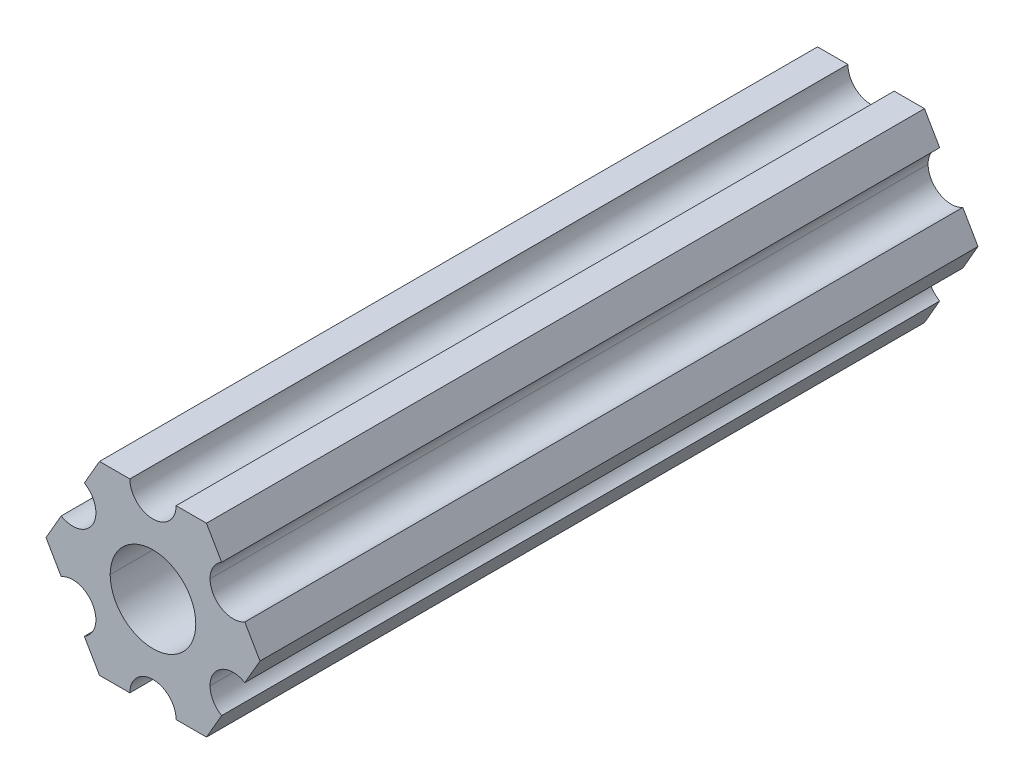
ISO-10303-21;
HEADER;
FILE_DESCRIPTION(('STEP AP214'),'2;1');
FILE_NAME('part.step','',(''),(''),'','','');
FILE_SCHEMA(('AUTOMOTIVE_DESIGN { 1 0 10303 214 1 1 1 1 }'));
ENDSEC;
DATA;
#1=APPLICATION_CONTEXT('core data for automotive mechanical design processes');
#2=APPLICATION_PROTOCOL_DEFINITION('international standard','automotive_design',2000,#1);
#3=PRODUCT_CONTEXT('',#1,'mechanical');
#4=PRODUCT('Part','Part','',(#3));
#5=PRODUCT_RELATED_PRODUCT_CATEGORY('part','',(#4));
#6=PRODUCT_DEFINITION_FORMATION('','',#4);
#7=PRODUCT_DEFINITION_CONTEXT('part definition',#1,'design');
#8=PRODUCT_DEFINITION('design','',#6,#7);
#9=PRODUCT_DEFINITION_SHAPE('','',#8);
#10=(LENGTH_UNIT() NAMED_UNIT(*) SI_UNIT(.MILLI.,.METRE.));
#11=(NAMED_UNIT(*) PLANE_ANGLE_UNIT() SI_UNIT($,.RADIAN.));
#12=(NAMED_UNIT(*) SI_UNIT($,.STERADIAN.) SOLID_ANGLE_UNIT());
#13=UNCERTAINTY_MEASURE_WITH_UNIT(LENGTH_MEASURE(1.E-05),#10,'distance_accuracy_value','');
#14=(GEOMETRIC_REPRESENTATION_CONTEXT(3) GLOBAL_UNCERTAINTY_ASSIGNED_CONTEXT((#13)) GLOBAL_UNIT_ASSIGNED_CONTEXT((#10,
#11,#12)) REPRESENTATION_CONTEXT('',''));
#15=CARTESIAN_POINT('',(0.,0.,0.));
#16=DIRECTION('',(0.,0.,1.));
#17=DIRECTION('',(1.,0.,0.));
#18=AXIS2_PLACEMENT_3D('',#15,#16,#17);
#19=CARTESIAN_POINT('',(0.,0.,304.8));
#20=DIRECTION('',(0.,0.,-1.));
#21=DIRECTION('',(-1.,0.,0.));
#22=AXIS2_PLACEMENT_3D('',#19,#20,#21);
#23=CYLINDRICAL_SURFACE('',#22,2.9337);
#24=CARTESIAN_POINT('',(0.,0.,49.2125));
#25=DIRECTION('',(0.,0.,1.));
#26=DIRECTION('',(1.,0.,0.));
#27=AXIS2_PLACEMENT_3D('',#24,#25,#26);
#28=CIRCLE('',#27,2.9337);
#29=CARTESIAN_POINT('',(2.9337,0.,49.2125));
#30=VERTEX_POINT('',#29);
#31=CARTESIAN_POINT('',(-2.9337,0.,49.2125));
#32=VERTEX_POINT('',#31);
#33=EDGE_CURVE('E66',#30,#32,#28,.F.);
#34=ORIENTED_EDGE('',*,*,#33,.F.);
#35=DIRECTION('',(0.,0.,-1.));
#36=VECTOR('',#35,1.);
#37=CARTESIAN_POINT('',(2.9337,0.,304.8));
#38=LINE('',#37,#36);
#39=CARTESIAN_POINT('',(2.9337,0.,0.));
#40=VERTEX_POINT('',#39);
#41=EDGE_CURVE('E53',#30,#40,#38,.T.);
#42=ORIENTED_EDGE('',*,*,#41,.T.);
#43=CARTESIAN_POINT('',(0.,0.,0.));
#44=DIRECTION('',(0.,0.,1.));
#45=DIRECTION('',(1.,0.,0.));
#46=AXIS2_PLACEMENT_3D('',#43,#44,#45);
#47=CIRCLE('',#46,2.9337);
#48=CARTESIAN_POINT('',(-2.9337,0.,0.));
#49=VERTEX_POINT('',#48);
#50=EDGE_CURVE('E249',#49,#40,#47,.T.);
#51=ORIENTED_EDGE('',*,*,#50,.F.);
#52=DIRECTION('',(0.,0.,-1.));
#53=VECTOR('',#52,1.);
#54=CARTESIAN_POINT('',(-2.9337,0.,304.8));
#55=LINE('',#54,#53);
#56=EDGE_CURVE('E219',#32,#49,#55,.T.);
#57=ORIENTED_EDGE('',*,*,#56,.F.);
#58=EDGE_LOOP('',(#34,#42,#51,#57));
#59=FACE_BOUND('',#58,.T.);
#60=ADVANCED_FACE('F46',(#59),#23,.F.);
#61=CARTESIAN_POINT('',(5.49926150638082,-3.17499966684067,304.8));
#62=DIRECTION('',(0.,0.,-1.));
#63=DIRECTION('',(-1.,0.,0.));
#64=AXIS2_PLACEMENT_3D('',#61,#62,#63);
#65=CYLINDRICAL_SURFACE('',#64,1.5875);
#66=CARTESIAN_POINT('',(5.49926150638082,-3.17499966684067,49.2125));
#67=DIRECTION('',(0.,0.,1.));
#68=DIRECTION('',(1.,0.,0.));
#69=AXIS2_PLACEMENT_3D('',#66,#67,#68);
#70=CIRCLE('',#69,1.5875);
#71=CARTESIAN_POINT('',(3.91176150638082,-3.17499966684067,49.2125));
#72=VERTEX_POINT('',#71);
#73=CARTESIAN_POINT('',(6.29301142309098,-1.80018429024546,49.2125));
#74=VERTEX_POINT('',#73);
#75=EDGE_CURVE('E373',#72,#74,#70,.F.);
#76=ORIENTED_EDGE('',*,*,#75,.F.);
#77=DIRECTION('',(0.,0.,-1.));
#78=VECTOR('',#77,1.);
#79=CARTESIAN_POINT('',(3.91176150638082,-3.17499966684067,304.8));
#80=LINE('',#79,#78);
#81=CARTESIAN_POINT('',(3.91176150638082,-3.17499966684067,0.));
#82=VERTEX_POINT('',#81);
#83=EDGE_CURVE('E226',#72,#82,#80,.T.);
#84=ORIENTED_EDGE('',*,*,#83,.T.);
#85=CARTESIAN_POINT('',(5.49926150638082,-3.17499966684067,0.));
#86=DIRECTION('',(0.,0.,-1.));
#87=DIRECTION('',(1.,0.,0.));
#88=AXIS2_PLACEMENT_3D('',#85,#86,#87);
#89=CIRCLE('',#88,1.5875);
#90=CARTESIAN_POINT('',(6.29301142309098,-1.80018429024546,0.));
#91=VERTEX_POINT('',#90);
#92=EDGE_CURVE('E228',#82,#91,#89,.T.);
#93=ORIENTED_EDGE('',*,*,#92,.T.);
#94=DIRECTION('',(0.,0.,-1.));
#95=VECTOR('',#94,1.);
#96=CARTESIAN_POINT('',(6.29301142309098,-1.80018429024546,304.8));
#97=LINE('',#96,#95);
#98=EDGE_CURVE('E354',#74,#91,#97,.T.);
#99=ORIENTED_EDGE('',*,*,#98,.F.);
#100=EDGE_LOOP('',(#76,#84,#93,#99));
#101=FACE_BOUND('',#100,.T.);
#102=ADVANCED_FACE('F409',(#101),#65,.F.);
#103=CARTESIAN_POINT('',(5.49926112168156,3.17500033315934,304.8));
#104=DIRECTION('',(0.,0.,-1.));
#105=DIRECTION('',(-1.,0.,0.));
#106=AXIS2_PLACEMENT_3D('',#103,#104,#105);
#107=CYLINDRICAL_SURFACE('',#106,1.5875);
#108=CARTESIAN_POINT('',(5.49926112168156,3.17500033315934,49.2125));
#109=DIRECTION('',(0.,0.,1.));
#110=DIRECTION('',(1.,0.,0.));
#111=AXIS2_PLACEMENT_3D('',#108,#109,#110);
#112=CIRCLE('',#111,1.5875);
#113=CARTESIAN_POINT('',(3.91176112168156,3.17500033315934,49.2125));
#114=VERTEX_POINT('',#113);
#115=CARTESIAN_POINT('',(4.70551103839172,4.54981561357972,49.2125));
#116=VERTEX_POINT('',#115);
#117=EDGE_CURVE('E375',#114,#116,#112,.F.);
#118=ORIENTED_EDGE('',*,*,#117,.F.);
#119=DIRECTION('',(0.,0.,-1.));
#120=VECTOR('',#119,1.);
#121=CARTESIAN_POINT('',(3.91176112168156,3.17500033315934,304.8));
#122=LINE('',#121,#120);
#123=CARTESIAN_POINT('',(3.91176112168156,3.17500033315934,0.));
#124=VERTEX_POINT('',#123);
#125=EDGE_CURVE('E248',#114,#124,#122,.T.);
#126=ORIENTED_EDGE('',*,*,#125,.T.);
#127=CARTESIAN_POINT('',(5.49926112168156,3.17500033315934,0.));
#128=DIRECTION('',(0.,0.,-1.));
#129=DIRECTION('',(1.,0.,0.));
#130=AXIS2_PLACEMENT_3D('',#127,#128,#129);
#131=CIRCLE('',#130,1.5875);
#132=CARTESIAN_POINT('',(4.70551103839172,4.54981561357972,0.));
#133=VERTEX_POINT('',#132);
#134=EDGE_CURVE('E244',#124,#133,#131,.T.);
#135=ORIENTED_EDGE('',*,*,#134,.T.);
#136=DIRECTION('',(0.,0.,-1.));
#137=VECTOR('',#136,1.);
#138=CARTESIAN_POINT('',(4.70551103839172,4.54981561357972,304.8));
#139=LINE('',#138,#137);
#140=EDGE_CURVE('E287',#116,#133,#139,.T.);
#141=ORIENTED_EDGE('',*,*,#140,.F.);
#142=EDGE_LOOP('',(#118,#126,#135,#141));
#143=FACE_BOUND('',#142,.T.);
#144=ADVANCED_FACE('F483',(#143),#107,.F.);
#145=CARTESIAN_POINT('',(6.29301142309098,-1.80018429024546,304.8));
#146=DIRECTION('',(-0.866025434075723,0.499999947533953,0.));
#147=DIRECTION('',(0.,0.,1.));
#148=AXIS2_PLACEMENT_3D('',#145,#146,#147);
#149=PLANE('',#148);
#150=DIRECTION('',(0.499999947533953,0.866025434075723,0.));
#151=VECTOR('',#150,1.);
#152=CARTESIAN_POINT('',(6.29301142309098,-1.80018429024546,49.2125));
#153=LINE('',#152,#151);
#154=CARTESIAN_POINT('',(7.33234841870827,4.44212519169686E-07,49.2125));
#155=VERTEX_POINT('',#154);
#156=EDGE_CURVE('E293',#74,#155,#153,.T.);
#157=ORIENTED_EDGE('',*,*,#156,.F.);
#158=ORIENTED_EDGE('',*,*,#98,.T.);
#159=DIRECTION('',(0.499999947533953,0.866025434075723,0.));
#160=VECTOR('',#159,1.);
#161=CARTESIAN_POINT('',(6.29301142309098,-1.80018429024546,0.));
#162=LINE('',#161,#160);
#163=CARTESIAN_POINT('',(7.33234841870827,4.44212519169686E-07,0.));
#164=VERTEX_POINT('',#163);
#165=EDGE_CURVE('E252',#91,#164,#162,.T.);
#166=ORIENTED_EDGE('',*,*,#165,.T.);
#167=DIRECTION('',(0.,0.,-1.));
#168=VECTOR('',#167,1.);
#169=CARTESIAN_POINT('',(7.33234841870827,4.44212519169686E-07,304.8));
#170=LINE('',#169,#168);
#171=EDGE_CURVE('E259',#155,#164,#170,.T.);
#172=ORIENTED_EDGE('',*,*,#171,.F.);
#173=EDGE_LOOP('',(#157,#158,#166,#172));
#174=FACE_BOUND('',#173,.T.);
#175=ADVANCED_FACE('F492',(#174),#149,.F.);
#176=CARTESIAN_POINT('',(7.33234841870827,4.44212519169686E-07,304.8));
#177=DIRECTION('',(-0.866025373493145,-0.500000052466057,0.));
#178=DIRECTION('',(-0.500000052466057,0.866025373493145,0.));
#179=AXIS2_PLACEMENT_3D('',#176,#177,#178);
#180=PLANE('',#179);
#181=DIRECTION('',(-0.500000052466057,0.866025373493145,0.));
#182=VECTOR('',#181,1.);
#183=CARTESIAN_POINT('',(7.33234841870827,4.44212519169686E-07,49.2125));
#184=LINE('',#183,#182);
#185=CARTESIAN_POINT('',(6.29301120497139,1.80018505273895,49.2125));
#186=VERTEX_POINT('',#185);
#187=EDGE_CURVE('E369',#155,#186,#184,.T.);
#188=ORIENTED_EDGE('',*,*,#187,.F.);
#189=ORIENTED_EDGE('',*,*,#171,.T.);
#190=DIRECTION('',(-0.500000052466056,0.866025373493145,0.));
#191=VECTOR('',#190,1.);
#192=CARTESIAN_POINT('',(7.33234841870827,4.44212519169686E-07,0.));
#193=LINE('',#192,#191);
#194=CARTESIAN_POINT('',(6.29301120497139,1.80018505273894,0.));
#195=VERTEX_POINT('',#194);
#196=EDGE_CURVE('E342',#164,#195,#193,.T.);
#197=ORIENTED_EDGE('',*,*,#196,.T.);
#198=DIRECTION('',(0.,0.,-1.));
#199=VECTOR('',#198,1.);
#200=CARTESIAN_POINT('',(6.29301120497139,1.80018505273894,304.8));
#201=LINE('',#200,#199);
#202=EDGE_CURVE('E257',#186,#195,#201,.T.);
#203=ORIENTED_EDGE('',*,*,#202,.F.);
#204=EDGE_LOOP('',(#188,#189,#197,#203));
#205=FACE_BOUND('',#204,.T.);
#206=ADVANCED_FACE('F490',(#205),#180,.F.);
#207=CARTESIAN_POINT('',(5.49926112168156,3.17500033315934,304.8));
#208=DIRECTION('',(0.,0.,-1.));
#209=DIRECTION('',(-1.,0.,0.));
#210=AXIS2_PLACEMENT_3D('',#207,#208,#209);
#211=CYLINDRICAL_SURFACE('',#210,1.5875);
#212=CARTESIAN_POINT('',(5.49926112168156,3.17500033315934,49.2125));
#213=DIRECTION('',(0.,0.,1.));
#214=DIRECTION('',(1.,0.,0.));
#215=AXIS2_PLACEMENT_3D('',#212,#213,#214);
#216=CIRCLE('',#215,1.5875);
#217=EDGE_CURVE('E371',#186,#114,#216,.F.);
#218=ORIENTED_EDGE('',*,*,#217,.F.);
#219=ORIENTED_EDGE('',*,*,#202,.T.);
#220=CARTESIAN_POINT('',(5.49926112168156,3.17500033315934,0.));
#221=DIRECTION('',(0.,0.,-1.));
#222=DIRECTION('',(1.,0.,0.));
#223=AXIS2_PLACEMENT_3D('',#220,#221,#222);
#224=CIRCLE('',#223,1.5875);
#225=EDGE_CURVE('E260',#195,#124,#224,.T.);
#226=ORIENTED_EDGE('',*,*,#225,.T.);
#227=ORIENTED_EDGE('',*,*,#125,.F.);
#228=EDGE_LOOP('',(#218,#219,#226,#227));
#229=FACE_BOUND('',#228,.T.);
#230=ADVANCED_FACE('F488',(#229),#211,.F.);
#231=CARTESIAN_POINT('',(4.70551103839172,4.54981561357972,304.8));
#232=DIRECTION('',(-0.866025373493151,-0.500000052466046,0.));
#233=DIRECTION('',(-0.500000052466046,0.866025373493151,0.));
#234=AXIS2_PLACEMENT_3D('',#231,#232,#233);
#235=PLANE('',#234);
#236=DIRECTION('',(-0.500000052466046,0.866025373493151,0.));
#237=VECTOR('',#236,1.);
#238=CARTESIAN_POINT('',(4.70551103839172,4.54981561357972,49.2125));
#239=LINE('',#238,#237);
#240=CARTESIAN_POINT('',(3.66617382465481,6.35000022210627,49.2125));
#241=VERTEX_POINT('',#240);
#242=EDGE_CURVE('E377',#116,#241,#239,.T.);
#243=ORIENTED_EDGE('',*,*,#242,.F.);
#244=ORIENTED_EDGE('',*,*,#140,.T.);
#245=DIRECTION('',(-0.500000052466046,0.866025373493151,0.));
#246=VECTOR('',#245,1.);
#247=CARTESIAN_POINT('',(4.70551103839172,4.54981561357972,0.));
#248=LINE('',#247,#246);
#249=CARTESIAN_POINT('',(3.66617382465481,6.35000022210627,0.));
#250=VERTEX_POINT('',#249);
#251=EDGE_CURVE('E306',#133,#250,#248,.T.);
#252=ORIENTED_EDGE('',*,*,#251,.T.);
#253=DIRECTION('',(0.,0.,-1.));
#254=VECTOR('',#253,1.);
#255=CARTESIAN_POINT('',(3.66617382465481,6.35000022210627,304.8));
#256=LINE('',#255,#254);
#257=EDGE_CURVE('E288',#241,#250,#256,.T.);
#258=ORIENTED_EDGE('',*,*,#257,.F.);
#259=EDGE_LOOP('',(#243,#244,#252,#258));
#260=FACE_BOUND('',#259,.T.);
#261=ADVANCED_FACE('F479',(#260),#235,.F.);
#262=CARTESIAN_POINT('',(3.66617382465481,6.35000022210627,304.8));
#263=DIRECTION('',(6.05825850611185E-08,-1.,0.));
#264=DIRECTION('',(0.,0.,-1.));
#265=AXIS2_PLACEMENT_3D('',#262,#263,#264);
#266=PLANE('',#265);
#267=DIRECTION('',(-0.999999999999998,-6.05825850611184E-08,0.));
#268=VECTOR('',#267,1.);
#269=CARTESIAN_POINT('',(3.66617382465481,6.35000022210627,49.2125));
#270=LINE('',#269,#268);
#271=CARTESIAN_POINT('',(1.58749961530074,6.35,49.2125));
#272=VERTEX_POINT('',#271);
#273=EDGE_CURVE('E379',#241,#272,#270,.T.);
#274=ORIENTED_EDGE('',*,*,#273,.F.);
#275=ORIENTED_EDGE('',*,*,#257,.T.);
#276=DIRECTION('',(-1.,-6.05825850611185E-08,0.));
#277=VECTOR('',#276,1.);
#278=CARTESIAN_POINT('',(3.66617382465481,6.35000022210627,0.));
#279=LINE('',#278,#277);
#280=CARTESIAN_POINT('',(1.58749961530074,6.35000009617482,0.));
#281=VERTEX_POINT('',#280);
#282=EDGE_CURVE('E283',#250,#281,#279,.T.);
#283=ORIENTED_EDGE('',*,*,#282,.T.);
#284=DIRECTION('',(0.,0.,-1.));
#285=VECTOR('',#284,1.);
#286=CARTESIAN_POINT('',(1.58749961530074,6.35000009617482,304.8));
#287=LINE('',#286,#285);
#288=EDGE_CURVE('E261',#272,#281,#287,.T.);
#289=ORIENTED_EDGE('',*,*,#288,.F.);
#290=EDGE_LOOP('',(#274,#275,#283,#289));
#291=FACE_BOUND('',#290,.T.);
#292=ADVANCED_FACE('F473',(#291),#266,.F.);
#293=CARTESIAN_POINT('',(-3.84699260060323E-07,6.35,304.8));
#294=DIRECTION('',(0.,0.,-1.));
#295=DIRECTION('',(-1.,0.,0.));
#296=AXIS2_PLACEMENT_3D('',#293,#294,#295);
#297=CYLINDRICAL_SURFACE('',#296,1.5875);
#298=CARTESIAN_POINT('',(-3.84699260060323E-07,6.35,49.2125));
#299=DIRECTION('',(0.,0.,1.));
#300=DIRECTION('',(1.,0.,0.));
#301=AXIS2_PLACEMENT_3D('',#298,#299,#300);
#302=CIRCLE('',#301,1.5875);
#303=CARTESIAN_POINT('',(-1.58750038469926,6.34999990382518,49.2125));
#304=VERTEX_POINT('',#303);
#305=EDGE_CURVE('E381',#272,#304,#302,.F.);
#306=ORIENTED_EDGE('',*,*,#305,.F.);
#307=ORIENTED_EDGE('',*,*,#288,.T.);
#308=CARTESIAN_POINT('',(-3.84699260060323E-07,6.35,0.));
#309=DIRECTION('',(0.,0.,-1.));
#310=DIRECTION('',(1.,0.,0.));
#311=AXIS2_PLACEMENT_3D('',#308,#309,#310);
#312=CIRCLE('',#311,1.5875);
#313=CARTESIAN_POINT('',(-1.58750038469926,6.34999990382519,0.));
#314=VERTEX_POINT('',#313);
#315=EDGE_CURVE('E263',#281,#314,#312,.T.);
#316=ORIENTED_EDGE('',*,*,#315,.T.);
#317=DIRECTION('',(0.,0.,-1.));
#318=VECTOR('',#317,1.);
#319=CARTESIAN_POINT('',(-1.58750038469926,6.34999990382519,304.8));
#320=LINE('',#319,#318);
#321=EDGE_CURVE('E300',#304,#314,#320,.T.);
#322=ORIENTED_EDGE('',*,*,#321,.F.);
#323=EDGE_LOOP('',(#306,#307,#316,#322));
#324=FACE_BOUND('',#323,.T.);
#325=ADVANCED_FACE('F469',(#324),#297,.F.);
#326=CARTESIAN_POINT('',(-1.58750038469926,6.34999990382518,304.8));
#327=DIRECTION('',(6.05825963273174E-08,-1.,0.));
#328=DIRECTION('',(0.,0.,-1.));
#329=AXIS2_PLACEMENT_3D('',#326,#327,#328);
#330=PLANE('',#329);
#331=DIRECTION('',(-0.999999999999998,-6.05825963273173E-08,0.));
#332=VECTOR('',#331,1.);
#333=CARTESIAN_POINT('',(-1.58750038469926,6.34999990382518,49.2125));
#334=LINE('',#333,#332);
#335=CARTESIAN_POINT('',(-3.66617459405349,6.3499997778937,49.2125));
#336=VERTEX_POINT('',#335);
#337=EDGE_CURVE('E383',#304,#336,#334,.T.);
#338=ORIENTED_EDGE('',*,*,#337,.F.);
#339=ORIENTED_EDGE('',*,*,#321,.T.);
#340=DIRECTION('',(-1.,-6.05825963273174E-08,0.));
#341=VECTOR('',#340,1.);
#342=CARTESIAN_POINT('',(-1.58750038469926,6.34999990382518,0.));
#343=LINE('',#342,#341);
#344=CARTESIAN_POINT('',(-3.66617459405349,6.3499997778937,0.));
#345=VERTEX_POINT('',#344);
#346=EDGE_CURVE('E264',#314,#345,#343,.T.);
#347=ORIENTED_EDGE('',*,*,#346,.T.);
#348=DIRECTION('',(0.,0.,-1.));
#349=VECTOR('',#348,1.);
#350=CARTESIAN_POINT('',(-3.66617459405349,6.3499997778937,304.8));
#351=LINE('',#350,#349);
#352=EDGE_CURVE('E279',#336,#345,#351,.T.);
#353=ORIENTED_EDGE('',*,*,#352,.F.);
#354=EDGE_LOOP('',(#338,#339,#347,#353));
#355=FACE_BOUND('',#354,.T.);
#356=ADVANCED_FACE('F511',(#355),#330,.F.);
#357=CARTESIAN_POINT('',(-3.66617459405349,6.3499997778937,304.8));
#358=DIRECTION('',(0.866025434075729,-0.499999947533942,0.));
#359=DIRECTION('',(0.,0.,-1.));
#360=AXIS2_PLACEMENT_3D('',#357,#358,#359);
#361=PLANE('',#360);
#362=DIRECTION('',(-0.499999947533942,-0.866025434075729,0.));
#363=VECTOR('',#362,1.);
#364=CARTESIAN_POINT('',(-3.66617459405349,6.3499997778937,49.2125));
#365=LINE('',#364,#363);
#366=CARTESIAN_POINT('',(-4.70551158967065,4.54981504343587,49.2125));
#367=VERTEX_POINT('',#366);
#368=EDGE_CURVE('E385',#336,#367,#365,.T.);
#369=ORIENTED_EDGE('',*,*,#368,.F.);
#370=ORIENTED_EDGE('',*,*,#352,.T.);
#371=DIRECTION('',(-0.499999947533943,-0.866025434075729,0.));
#372=VECTOR('',#371,1.);
#373=CARTESIAN_POINT('',(-3.66617459405349,6.3499997778937,0.));
#374=LINE('',#373,#372);
#375=CARTESIAN_POINT('',(-4.70551158967065,4.54981504343587,0.));
#376=VERTEX_POINT('',#375);
#377=EDGE_CURVE('E281',#345,#376,#374,.T.);
#378=ORIENTED_EDGE('',*,*,#377,.T.);
#379=DIRECTION('',(0.,0.,-1.));
#380=VECTOR('',#379,1.);
#381=CARTESIAN_POINT('',(-4.70551158967065,4.54981504343587,304.8));
#382=LINE('',#381,#380);
#383=EDGE_CURVE('E256',#367,#376,#382,.T.);
#384=ORIENTED_EDGE('',*,*,#383,.F.);
#385=EDGE_LOOP('',(#369,#370,#378,#384));
#386=FACE_BOUND('',#385,.T.);
#387=ADVANCED_FACE('F464',(#386),#361,.F.);
#388=CARTESIAN_POINT('',(-5.49926150638082,3.17499966684067,304.8));
#389=DIRECTION('',(0.,0.,-1.));
#390=DIRECTION('',(-1.,0.,0.));
#391=AXIS2_PLACEMENT_3D('',#388,#389,#390);
#392=CYLINDRICAL_SURFACE('',#391,1.5875);
#393=CARTESIAN_POINT('',(-5.49926150638082,3.17499966684067,49.2125));
#394=DIRECTION('',(0.,0.,1.));
#395=DIRECTION('',(1.,0.,0.));
#396=AXIS2_PLACEMENT_3D('',#393,#394,#395);
#397=CIRCLE('',#396,1.5875);
#398=CARTESIAN_POINT('',(-6.29301142309098,1.80018429024547,49.2125));
#399=VERTEX_POINT('',#398);
#400=EDGE_CURVE('E387',#367,#399,#397,.F.);
#401=ORIENTED_EDGE('',*,*,#400,.F.);
#402=ORIENTED_EDGE('',*,*,#383,.T.);
#403=CARTESIAN_POINT('',(-5.49926150638082,3.17499966684067,0.));
#404=DIRECTION('',(0.,0.,-1.));
#405=DIRECTION('',(1.,0.,0.));
#406=AXIS2_PLACEMENT_3D('',#403,#404,#405);
#407=CIRCLE('',#406,1.5875);
#408=CARTESIAN_POINT('',(-6.29301142309098,1.80018429024547,0.));
#409=VERTEX_POINT('',#408);
#410=EDGE_CURVE('E282',#376,#409,#407,.T.);
#411=ORIENTED_EDGE('',*,*,#410,.T.);
#412=DIRECTION('',(0.,0.,-1.));
#413=VECTOR('',#412,1.);
#414=CARTESIAN_POINT('',(-6.29301142309098,1.80018429024547,304.8));
#415=LINE('',#414,#413);
#416=EDGE_CURVE('E232',#399,#409,#415,.T.);
#417=ORIENTED_EDGE('',*,*,#416,.F.);
#418=EDGE_LOOP('',(#401,#402,#411,#417));
#419=FACE_BOUND('',#418,.T.);
#420=ADVANCED_FACE('F460',(#419),#392,.F.);
#421=CARTESIAN_POINT('',(-6.29301142309098,1.80018429024547,304.8));
#422=DIRECTION('',(0.866025434075724,-0.499999947533952,0.));
#423=DIRECTION('',(0.,0.,-1.));
#424=AXIS2_PLACEMENT_3D('',#421,#422,#423);
#425=PLANE('',#424);
#426=DIRECTION('',(-0.499999947533952,-0.866025434075724,0.));
#427=VECTOR('',#426,1.);
#428=CARTESIAN_POINT('',(-6.29301142309098,1.80018429024547,49.2125));
#429=LINE('',#428,#427);
#430=CARTESIAN_POINT('',(-7.33234841870827,-4.44212523790841E-07,49.2125));
#431=VERTEX_POINT('',#430);
#432=EDGE_CURVE('E389',#399,#431,#429,.T.);
#433=ORIENTED_EDGE('',*,*,#432,.F.);
#434=ORIENTED_EDGE('',*,*,#416,.T.);
#435=DIRECTION('',(-0.499999947533951,-0.866025434075724,0.));
#436=VECTOR('',#435,1.);
#437=CARTESIAN_POINT('',(-6.29301142309098,1.80018429024547,0.));
#438=LINE('',#437,#436);
#439=CARTESIAN_POINT('',(-7.33234841870827,-4.44212523790841E-07,0.));
#440=VERTEX_POINT('',#439);
#441=EDGE_CURVE('E234',#409,#440,#438,.T.);
#442=ORIENTED_EDGE('',*,*,#441,.T.);
#443=DIRECTION('',(0.,0.,-1.));
#444=VECTOR('',#443,1.);
#445=CARTESIAN_POINT('',(-7.33234841870827,-4.44212523790841E-07,304.8));
#446=LINE('',#445,#444);
#447=EDGE_CURVE('E265',#431,#440,#446,.T.);
#448=ORIENTED_EDGE('',*,*,#447,.F.);
#449=EDGE_LOOP('',(#433,#434,#442,#448));
#450=FACE_BOUND('',#449,.T.);
#451=ADVANCED_FACE('F454',(#450),#425,.F.);
#452=CARTESIAN_POINT('',(-7.33234841870827,-4.44212523790841E-07,304.8));
#453=DIRECTION('',(0.866025373493151,0.500000052466045,0.));
#454=DIRECTION('',(0.,0.,-1.));
#455=AXIS2_PLACEMENT_3D('',#452,#453,#454);
#456=PLANE('',#455);
#457=DIRECTION('',(0.500000052466045,-0.866025373493151,0.));
#458=VECTOR('',#457,1.);
#459=CARTESIAN_POINT('',(-7.33234841870827,-4.44212523790841E-07,49.2125));
#460=LINE('',#459,#458);
#461=CARTESIAN_POINT('',(-6.29301120497141,-1.80018505273896,49.2125));
#462=VERTEX_POINT('',#461);
#463=EDGE_CURVE('E391',#431,#462,#460,.T.);
#464=ORIENTED_EDGE('',*,*,#463,.F.);
#465=ORIENTED_EDGE('',*,*,#447,.T.);
#466=DIRECTION('',(0.500000052466045,-0.866025373493151,0.));
#467=VECTOR('',#466,1.);
#468=CARTESIAN_POINT('',(-7.33234841870827,-4.44212523790841E-07,0.));
#469=LINE('',#468,#467);
#470=CARTESIAN_POINT('',(-6.29301120497141,-1.80018505273897,0.));
#471=VERTEX_POINT('',#470);
#472=EDGE_CURVE('E235',#440,#471,#469,.T.);
#473=ORIENTED_EDGE('',*,*,#472,.T.);
#474=DIRECTION('',(0.,0.,-1.));
#475=VECTOR('',#474,1.);
#476=CARTESIAN_POINT('',(-6.29301120497141,-1.80018505273897,304.8));
#477=LINE('',#476,#475);
#478=EDGE_CURVE('E243',#462,#471,#477,.T.);
#479=ORIENTED_EDGE('',*,*,#478,.F.);
#480=EDGE_LOOP('',(#464,#465,#473,#479));
#481=FACE_BOUND('',#480,.T.);
#482=ADVANCED_FACE('F450',(#481),#456,.F.);
#483=CARTESIAN_POINT('',(-5.49926112168156,-3.17500033315934,304.8));
#484=DIRECTION('',(0.,0.,-1.));
#485=DIRECTION('',(-1.,0.,0.));
#486=AXIS2_PLACEMENT_3D('',#483,#484,#485);
#487=CYLINDRICAL_SURFACE('',#486,1.5875);
#488=CARTESIAN_POINT('',(-5.49926112168156,-3.17500033315934,49.2125));
#489=DIRECTION('',(0.,0.,1.));
#490=DIRECTION('',(1.,0.,0.));
#491=AXIS2_PLACEMENT_3D('',#488,#489,#490);
#492=CIRCLE('',#491,1.5875);
#493=CARTESIAN_POINT('',(-4.70551103839172,-4.54981561357972,49.2125));
#494=VERTEX_POINT('',#493);
#495=EDGE_CURVE('E393',#462,#494,#492,.F.);
#496=ORIENTED_EDGE('',*,*,#495,.F.);
#497=ORIENTED_EDGE('',*,*,#478,.T.);
#498=CARTESIAN_POINT('',(-5.49926112168156,-3.17500033315934,0.));
#499=DIRECTION('',(0.,0.,-1.));
#500=DIRECTION('',(1.,0.,0.));
#501=AXIS2_PLACEMENT_3D('',#498,#499,#500);
#502=CIRCLE('',#501,1.5875);
#503=CARTESIAN_POINT('',(-4.70551103839172,-4.54981561357972,0.));
#504=VERTEX_POINT('',#503);
#505=EDGE_CURVE('E267',#471,#504,#502,.T.);
#506=ORIENTED_EDGE('',*,*,#505,.T.);
#507=DIRECTION('',(0.,0.,-1.));
#508=VECTOR('',#507,1.);
#509=CARTESIAN_POINT('',(-4.70551103839172,-4.54981561357972,304.8));
#510=LINE('',#509,#508);
#511=EDGE_CURVE('E236',#494,#504,#510,.T.);
#512=ORIENTED_EDGE('',*,*,#511,.F.);
#513=EDGE_LOOP('',(#496,#497,#506,#512));
#514=FACE_BOUND('',#513,.T.);
#515=ADVANCED_FACE('F444',(#514),#487,.F.);
#516=CARTESIAN_POINT('',(-4.70551103839172,-4.54981561357972,304.8));
#517=DIRECTION('',(0.866025373493152,0.500000052466045,0.));
#518=DIRECTION('',(0.,0.,-1.));
#519=AXIS2_PLACEMENT_3D('',#516,#517,#518);
#520=PLANE('',#519);
#521=DIRECTION('',(0.500000052466045,-0.866025373493152,0.));
#522=VECTOR('',#521,1.);
#523=CARTESIAN_POINT('',(-4.70551103839172,-4.54981561357972,49.2125));
#524=LINE('',#523,#522);
#525=CARTESIAN_POINT('',(-3.66617382465481,-6.35000022210628,49.2125));
#526=VERTEX_POINT('',#525);
#527=EDGE_CURVE('E395',#494,#526,#524,.T.);
#528=ORIENTED_EDGE('',*,*,#527,.F.);
#529=ORIENTED_EDGE('',*,*,#511,.T.);
#530=DIRECTION('',(0.500000052466045,-0.866025373493152,0.));
#531=VECTOR('',#530,1.);
#532=CARTESIAN_POINT('',(-4.70551103839172,-4.54981561357972,0.));
#533=LINE('',#532,#531);
#534=CARTESIAN_POINT('',(-3.66617382465481,-6.35000022210628,0.));
#535=VERTEX_POINT('',#534);
#536=EDGE_CURVE('E238',#504,#535,#533,.T.);
#537=ORIENTED_EDGE('',*,*,#536,.T.);
#538=DIRECTION('',(0.,0.,-1.));
#539=VECTOR('',#538,1.);
#540=CARTESIAN_POINT('',(-3.66617382465481,-6.35000022210628,304.8));
#541=LINE('',#540,#539);
#542=EDGE_CURVE('E340',#526,#535,#541,.T.);
#543=ORIENTED_EDGE('',*,*,#542,.F.);
#544=EDGE_LOOP('',(#528,#529,#537,#543));
#545=FACE_BOUND('',#544,.T.);
#546=ADVANCED_FACE('F440',(#545),#520,.F.);
#547=CARTESIAN_POINT('',(-3.66617382465481,-6.35000022210628,304.8));
#548=DIRECTION('',(-6.05825854783851E-08,1.,0.));
#549=DIRECTION('',(0.,0.,1.));
#550=AXIS2_PLACEMENT_3D('',#547,#548,#549);
#551=PLANE('',#550);
#552=DIRECTION('',(0.999999999999998,6.0582585478385E-08,0.));
#553=VECTOR('',#552,1.);
#554=CARTESIAN_POINT('',(-3.66617382465481,-6.35000022210628,49.2125));
#555=LINE('',#554,#553);
#556=CARTESIAN_POINT('',(-1.58749961530073,-6.35000009617482,49.2125));
#557=VERTEX_POINT('',#556);
#558=EDGE_CURVE('E397',#526,#557,#555,.T.);
#559=ORIENTED_EDGE('',*,*,#558,.F.);
#560=ORIENTED_EDGE('',*,*,#542,.T.);
#561=DIRECTION('',(1.,6.05825854783851E-08,0.));
#562=VECTOR('',#561,1.);
#563=CARTESIAN_POINT('',(-3.66617382465481,-6.35000022210628,0.));
#564=LINE('',#563,#562);
#565=CARTESIAN_POINT('',(-1.58749961530073,-6.35000009617482,0.));
#566=VERTEX_POINT('',#565);
#567=EDGE_CURVE('E239',#535,#566,#564,.T.);
#568=ORIENTED_EDGE('',*,*,#567,.T.);
#569=DIRECTION('',(0.,0.,-1.));
#570=VECTOR('',#569,1.);
#571=CARTESIAN_POINT('',(-1.58749961530073,-6.35000009617482,304.8));
#572=LINE('',#571,#570);
#573=EDGE_CURVE('E305',#557,#566,#572,.T.);
#574=ORIENTED_EDGE('',*,*,#573,.F.);
#575=EDGE_LOOP('',(#559,#560,#568,#574));
#576=FACE_BOUND('',#575,.T.);
#577=ADVANCED_FACE('F434',(#576),#551,.F.);
#578=CARTESIAN_POINT('',(3.8469926204343E-07,-6.35,304.8));
#579=DIRECTION('',(0.,0.,-1.));
#580=DIRECTION('',(-1.,0.,0.));
#581=AXIS2_PLACEMENT_3D('',#578,#579,#580);
#582=CYLINDRICAL_SURFACE('',#581,1.5875);
#583=CARTESIAN_POINT('',(3.8469926204343E-07,-6.35,49.2125));
#584=DIRECTION('',(0.,0.,1.));
#585=DIRECTION('',(1.,0.,0.));
#586=AXIS2_PLACEMENT_3D('',#583,#584,#585);
#587=CIRCLE('',#586,1.5875);
#588=CARTESIAN_POINT('',(1.58750038469926,-6.34999990382518,49.2125));
#589=VERTEX_POINT('',#588);
#590=EDGE_CURVE('E399',#557,#589,#587,.F.);
#591=ORIENTED_EDGE('',*,*,#590,.F.);
#592=ORIENTED_EDGE('',*,*,#573,.T.);
#593=CARTESIAN_POINT('',(3.8469926204343E-07,-6.35,0.));
#594=DIRECTION('',(0.,0.,-1.));
#595=DIRECTION('',(1.,0.,0.));
#596=AXIS2_PLACEMENT_3D('',#593,#594,#595);
#597=CIRCLE('',#596,1.5875);
#598=CARTESIAN_POINT('',(1.58750038469926,-6.34999990382518,0.));
#599=VERTEX_POINT('',#598);
#600=EDGE_CURVE('E336',#566,#599,#597,.T.);
#601=ORIENTED_EDGE('',*,*,#600,.T.);
#602=DIRECTION('',(0.,0.,-1.));
#603=VECTOR('',#602,1.);
#604=CARTESIAN_POINT('',(1.58750038469926,-6.34999990382518,304.8));
#605=LINE('',#604,#603);
#606=EDGE_CURVE('E273',#589,#599,#605,.T.);
#607=ORIENTED_EDGE('',*,*,#606,.F.);
#608=EDGE_LOOP('',(#591,#592,#601,#607));
#609=FACE_BOUND('',#608,.T.);
#610=ADVANCED_FACE('F430',(#609),#582,.F.);
#611=CARTESIAN_POINT('',(1.58750038469926,-6.34999990382518,304.8));
#612=DIRECTION('',(-6.05825721258438E-08,1.,0.));
#613=DIRECTION('',(0.,0.,1.));
#614=AXIS2_PLACEMENT_3D('',#611,#612,#613);
#615=PLANE('',#614);
#616=DIRECTION('',(0.999999999999998,6.05825721258437E-08,0.));
#617=VECTOR('',#616,1.);
#618=CARTESIAN_POINT('',(1.58750038469926,-6.34999990382518,49.2125));
#619=LINE('',#618,#617);
#620=CARTESIAN_POINT('',(3.66617459405346,-6.34999977789375,49.2125));
#621=VERTEX_POINT('',#620);
#622=EDGE_CURVE('E401',#589,#621,#619,.T.);
#623=ORIENTED_EDGE('',*,*,#622,.F.);
#624=ORIENTED_EDGE('',*,*,#606,.T.);
#625=DIRECTION('',(1.,6.05825721258438E-08,0.));
#626=VECTOR('',#625,1.);
#627=CARTESIAN_POINT('',(1.58750038469926,-6.34999990382518,0.));
#628=LINE('',#627,#626);
#629=CARTESIAN_POINT('',(3.66617459405346,-6.34999977789375,0.));
#630=VERTEX_POINT('',#629);
#631=EDGE_CURVE('E301',#599,#630,#628,.T.);
#632=ORIENTED_EDGE('',*,*,#631,.T.);
#633=DIRECTION('',(0.,0.,-1.));
#634=VECTOR('',#633,1.);
#635=CARTESIAN_POINT('',(3.66617459405346,-6.34999977789375,304.8));
#636=LINE('',#635,#634);
#637=EDGE_CURVE('E274',#621,#630,#636,.T.);
#638=ORIENTED_EDGE('',*,*,#637,.F.);
#639=EDGE_LOOP('',(#623,#624,#632,#638));
#640=FACE_BOUND('',#639,.T.);
#641=ADVANCED_FACE('F424',(#640),#615,.F.);
#642=CARTESIAN_POINT('',(3.66617459405346,-6.34999977789375,304.8));
#643=DIRECTION('',(-0.86602543407573,0.499999947533941,0.));
#644=DIRECTION('',(0.,0.,1.));
#645=AXIS2_PLACEMENT_3D('',#642,#643,#644);
#646=PLANE('',#645);
#647=DIRECTION('',(0.499999947533941,0.86602543407573,0.));
#648=VECTOR('',#647,1.);
#649=CARTESIAN_POINT('',(3.66617459405346,-6.34999977789375,49.2125));
#650=LINE('',#649,#648);
#651=CARTESIAN_POINT('',(4.70551158967065,-4.54981504343587,49.2125));
#652=VERTEX_POINT('',#651);
#653=EDGE_CURVE('E60',#621,#652,#650,.T.);
#654=ORIENTED_EDGE('',*,*,#653,.F.);
#655=ORIENTED_EDGE('',*,*,#637,.T.);
#656=DIRECTION('',(0.499999947533941,0.86602543407573,0.));
#657=VECTOR('',#656,1.);
#658=CARTESIAN_POINT('',(3.66617459405346,-6.34999977789375,0.));
#659=LINE('',#658,#657);
#660=CARTESIAN_POINT('',(4.70551158967065,-4.54981504343587,0.));
#661=VERTEX_POINT('',#660);
#662=EDGE_CURVE('E269',#630,#661,#659,.T.);
#663=ORIENTED_EDGE('',*,*,#662,.T.);
#664=DIRECTION('',(0.,0.,-1.));
#665=VECTOR('',#664,1.);
#666=CARTESIAN_POINT('',(4.70551158967065,-4.54981504343587,304.8));
#667=LINE('',#666,#665);
#668=EDGE_CURVE('E275',#652,#661,#667,.T.);
#669=ORIENTED_EDGE('',*,*,#668,.F.);
#670=EDGE_LOOP('',(#654,#655,#663,#669));
#671=FACE_BOUND('',#670,.T.);
#672=ADVANCED_FACE('F420',(#671),#646,.F.);
#673=CARTESIAN_POINT('',(5.49926150638082,-3.17499966684067,304.8));
#674=DIRECTION('',(0.,0.,-1.));
#675=DIRECTION('',(-1.,0.,0.));
#676=AXIS2_PLACEMENT_3D('',#673,#674,#675);
#677=CYLINDRICAL_SURFACE('',#676,1.5875);
#678=CARTESIAN_POINT('',(5.49926150638082,-3.17499966684067,49.2125));
#679=DIRECTION('',(0.,0.,1.));
#680=DIRECTION('',(1.,0.,0.));
#681=AXIS2_PLACEMENT_3D('',#678,#679,#680);
#682=CIRCLE('',#681,1.5875);
#683=EDGE_CURVE('E220',#652,#72,#682,.F.);
#684=ORIENTED_EDGE('',*,*,#683,.F.);
#685=ORIENTED_EDGE('',*,*,#668,.T.);
#686=CARTESIAN_POINT('',(5.49926150638082,-3.17499966684067,0.));
#687=DIRECTION('',(0.,0.,-1.));
#688=DIRECTION('',(1.,0.,0.));
#689=AXIS2_PLACEMENT_3D('',#686,#687,#688);
#690=CIRCLE('',#689,1.5875);
#691=EDGE_CURVE('E277',#661,#82,#690,.T.);
#692=ORIENTED_EDGE('',*,*,#691,.T.);
#693=ORIENTED_EDGE('',*,*,#83,.F.);
#694=EDGE_LOOP('',(#684,#685,#692,#693));
#695=FACE_BOUND('',#694,.T.);
#696=ADVANCED_FACE('F411',(#695),#677,.F.);
#697=CARTESIAN_POINT('',(0.,0.,304.8));
#698=DIRECTION('',(0.,0.,-1.));
#699=DIRECTION('',(-1.,0.,0.));
#700=AXIS2_PLACEMENT_3D('',#697,#698,#699);
#701=CYLINDRICAL_SURFACE('',#700,2.9337);
#702=CARTESIAN_POINT('',(0.,0.,49.2125));
#703=DIRECTION('',(0.,0.,1.));
#704=DIRECTION('',(1.,0.,0.));
#705=AXIS2_PLACEMENT_3D('',#702,#703,#704);
#706=CIRCLE('',#705,2.9337);
#707=EDGE_CURVE('E12',#32,#30,#706,.F.);
#708=ORIENTED_EDGE('',*,*,#707,.F.);
#709=ORIENTED_EDGE('',*,*,#56,.T.);
#710=CARTESIAN_POINT('',(0.,0.,0.));
#711=DIRECTION('',(0.,0.,1.));
#712=DIRECTION('',(1.,0.,0.));
#713=AXIS2_PLACEMENT_3D('',#710,#711,#712);
#714=CIRCLE('',#713,2.9337);
#715=EDGE_CURVE('E225',#40,#49,#714,.T.);
#716=ORIENTED_EDGE('',*,*,#715,.F.);
#717=ORIENTED_EDGE('',*,*,#41,.F.);
#718=EDGE_LOOP('',(#708,#709,#716,#717));
#719=FACE_BOUND('',#718,.T.);
#720=ADVANCED_FACE('F223',(#719),#701,.F.);
#721=CARTESIAN_POINT('',(5.49926112168156,3.17500033315934,0.));
#722=DIRECTION('',(0.,0.,1.));
#723=DIRECTION('',(1.,0.,0.));
#724=AXIS2_PLACEMENT_3D('',#721,#722,#723);
#725=PLANE('',#724);
#726=ORIENTED_EDGE('',*,*,#165,.F.);
#727=ORIENTED_EDGE('',*,*,#92,.F.);
#728=ORIENTED_EDGE('',*,*,#691,.F.);
#729=ORIENTED_EDGE('',*,*,#662,.F.);
#730=ORIENTED_EDGE('',*,*,#631,.F.);
#731=ORIENTED_EDGE('',*,*,#600,.F.);
#732=ORIENTED_EDGE('',*,*,#567,.F.);
#733=ORIENTED_EDGE('',*,*,#536,.F.);
#734=ORIENTED_EDGE('',*,*,#505,.F.);
#735=ORIENTED_EDGE('',*,*,#472,.F.);
#736=ORIENTED_EDGE('',*,*,#441,.F.);
#737=ORIENTED_EDGE('',*,*,#410,.F.);
#738=ORIENTED_EDGE('',*,*,#377,.F.);
#739=ORIENTED_EDGE('',*,*,#346,.F.);
#740=ORIENTED_EDGE('',*,*,#315,.F.);
#741=ORIENTED_EDGE('',*,*,#282,.F.);
#742=ORIENTED_EDGE('',*,*,#251,.F.);
#743=ORIENTED_EDGE('',*,*,#134,.F.);
#744=ORIENTED_EDGE('',*,*,#225,.F.);
#745=ORIENTED_EDGE('',*,*,#196,.F.);
#746=EDGE_LOOP('',(#726,#727,#728,#729,#730,#731,#732,#733,#734,#735,#736,#737,#738,#739,#740,
#741,#742,#743,#744,#745));
#747=FACE_BOUND('',#746,.T.);
#748=ORIENTED_EDGE('',*,*,#50,.T.);
#749=ORIENTED_EDGE('',*,*,#715,.T.);
#750=EDGE_LOOP('',(#748,#749));
#751=FACE_BOUND('',#750,.T.);
#752=ADVANCED_FACE('F416',(#747,#751),#725,.F.);
#753=CARTESIAN_POINT('',(5.49926112168156,3.17500033315934,49.2125));
#754=DIRECTION('',(0.,0.,1.));
#755=DIRECTION('',(1.,0.,0.));
#756=AXIS2_PLACEMENT_3D('',#753,#754,#755);
#757=PLANE('',#756);
#758=ORIENTED_EDGE('',*,*,#33,.T.);
#759=ORIENTED_EDGE('',*,*,#707,.T.);
#760=EDGE_LOOP('',(#758,#759));
#761=FACE_BOUND('',#760,.T.);
#762=ORIENTED_EDGE('',*,*,#156,.T.);
#763=ORIENTED_EDGE('',*,*,#187,.T.);
#764=ORIENTED_EDGE('',*,*,#217,.T.);
#765=ORIENTED_EDGE('',*,*,#117,.T.);
#766=ORIENTED_EDGE('',*,*,#242,.T.);
#767=ORIENTED_EDGE('',*,*,#273,.T.);
#768=ORIENTED_EDGE('',*,*,#305,.T.);
#769=ORIENTED_EDGE('',*,*,#337,.T.);
#770=ORIENTED_EDGE('',*,*,#368,.T.);
#771=ORIENTED_EDGE('',*,*,#400,.T.);
#772=ORIENTED_EDGE('',*,*,#432,.T.);
#773=ORIENTED_EDGE('',*,*,#463,.T.);
#774=ORIENTED_EDGE('',*,*,#495,.T.);
#775=ORIENTED_EDGE('',*,*,#527,.T.);
#776=ORIENTED_EDGE('',*,*,#558,.T.);
#777=ORIENTED_EDGE('',*,*,#590,.T.);
#778=ORIENTED_EDGE('',*,*,#622,.T.);
#779=ORIENTED_EDGE('',*,*,#653,.T.);
#780=ORIENTED_EDGE('',*,*,#683,.T.);
#781=ORIENTED_EDGE('',*,*,#75,.T.);
#782=EDGE_LOOP('',(#762,#763,#764,#765,#766,#767,#768,#769,#770,#771,#772,#773,#774,#775,#776,
#777,#778,#779,#780,#781));
#783=FACE_BOUND('',#782,.T.);
#784=ADVANCED_FACE('F212',(#761,#783),#757,.T.);
#785=CLOSED_SHELL('',(#60,#102,#144,#175,#206,#230,#261,#292,#325,#356,#387,#420,#451,#482,#515,
#546,#577,#610,#641,#672,#696,#720,#752,#784));
#786=MANIFOLD_SOLID_BREP('B2',#785);
#787=ADVANCED_BREP_SHAPE_REPRESENTATION('',(#18,#786),#14);
#788=SHAPE_DEFINITION_REPRESENTATION(#9,#787);
ENDSEC;
END-ISO-10303-21;
